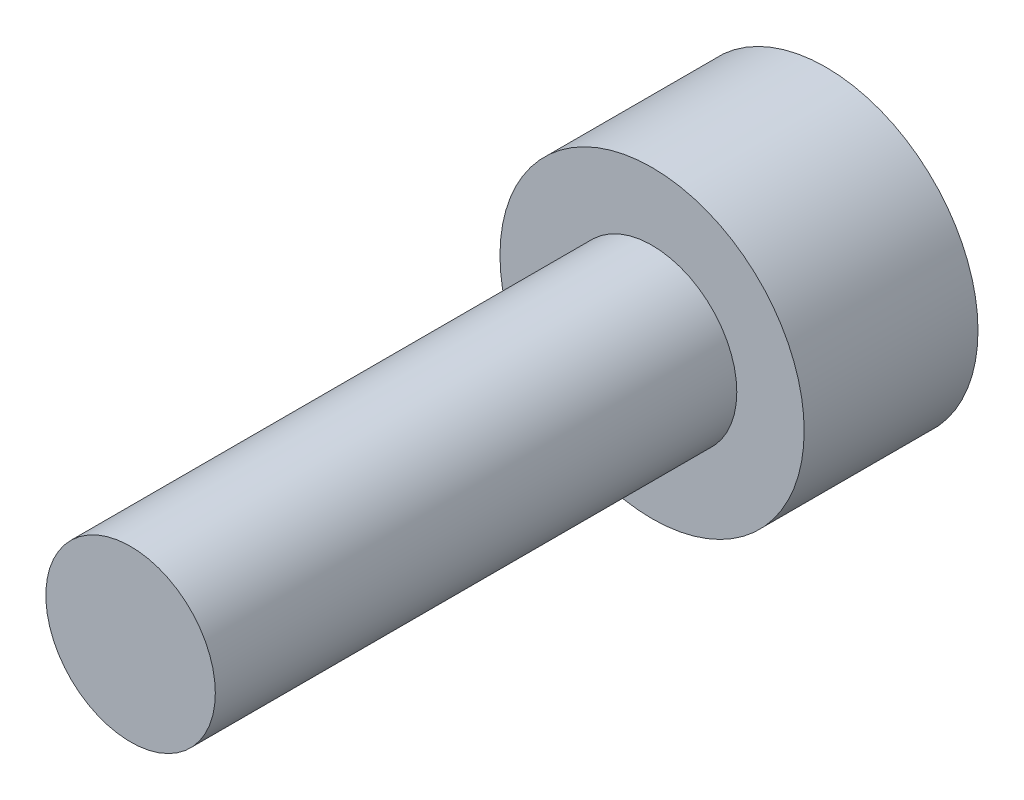
ISO-10303-21;
HEADER;
FILE_DESCRIPTION(('STEP AP214'),'2;1');
FILE_NAME('part.step','',(''),(''),'','','');
FILE_SCHEMA(('AUTOMOTIVE_DESIGN { 1 0 10303 214 1 1 1 1 }'));
ENDSEC;
DATA;
#1=APPLICATION_CONTEXT('core data for automotive mechanical design processes');
#2=APPLICATION_PROTOCOL_DEFINITION('international standard','automotive_design',2000,#1);
#3=PRODUCT_CONTEXT('',#1,'mechanical');
#4=PRODUCT('Part','Part','',(#3));
#5=PRODUCT_RELATED_PRODUCT_CATEGORY('part','',(#4));
#6=PRODUCT_DEFINITION_FORMATION('','',#4);
#7=PRODUCT_DEFINITION_CONTEXT('part definition',#1,'design');
#8=PRODUCT_DEFINITION('design','',#6,#7);
#9=PRODUCT_DEFINITION_SHAPE('','',#8);
#10=(LENGTH_UNIT() NAMED_UNIT(*) SI_UNIT(.MILLI.,.METRE.));
#11=(NAMED_UNIT(*) PLANE_ANGLE_UNIT() SI_UNIT($,.RADIAN.));
#12=(NAMED_UNIT(*) SI_UNIT($,.STERADIAN.) SOLID_ANGLE_UNIT());
#13=UNCERTAINTY_MEASURE_WITH_UNIT(LENGTH_MEASURE(1.E-05),#10,'distance_accuracy_value','');
#14=(GEOMETRIC_REPRESENTATION_CONTEXT(3) GLOBAL_UNCERTAINTY_ASSIGNED_CONTEXT((#13)) GLOBAL_UNIT_ASSIGNED_CONTEXT((#10,
#11,#12)) REPRESENTATION_CONTEXT('',''));
#15=CARTESIAN_POINT('',(0.,0.,0.));
#16=DIRECTION('',(0.,0.,1.));
#17=DIRECTION('',(1.,0.,0.));
#18=AXIS2_PLACEMENT_3D('',#15,#16,#17);
#19=CARTESIAN_POINT('',(0.,0.,12.));
#20=DIRECTION('',(0.,0.,-1.));
#21=DIRECTION('',(-1.,0.,0.));
#22=AXIS2_PLACEMENT_3D('',#19,#20,#21);
#23=CYLINDRICAL_SURFACE('',#22,1.95);
#24=CARTESIAN_POINT('',(0.,0.,12.));
#25=DIRECTION('',(0.,0.,1.));
#26=DIRECTION('',(1.,0.,0.));
#27=AXIS2_PLACEMENT_3D('',#24,#25,#26);
#28=CIRCLE('',#27,1.95);
#29=CARTESIAN_POINT('',(1.95,0.,12.));
#30=VERTEX_POINT('',#29);
#31=EDGE_CURVE('E10',#30,#30,#28,.T.);
#32=ORIENTED_EDGE('',*,*,#31,.F.);
#33=EDGE_LOOP('',(#32));
#34=FACE_BOUND('',#33,.T.);
#35=CARTESIAN_POINT('',(0.,0.,0.));
#36=DIRECTION('',(0.,0.,1.));
#37=DIRECTION('',(1.,0.,0.));
#38=AXIS2_PLACEMENT_3D('',#35,#36,#37);
#39=CIRCLE('',#38,1.95);
#40=CARTESIAN_POINT('',(1.95,0.,0.));
#41=VERTEX_POINT('',#40);
#42=EDGE_CURVE('E37',#41,#41,#39,.T.);
#43=ORIENTED_EDGE('',*,*,#42,.T.);
#44=EDGE_LOOP('',(#43));
#45=FACE_BOUND('',#44,.T.);
#46=ADVANCED_FACE('F31',(#34,#45),#23,.T.);
#47=CARTESIAN_POINT('',(0.,0.,12.));
#48=DIRECTION('',(0.,0.,1.));
#49=DIRECTION('',(1.,0.,0.));
#50=AXIS2_PLACEMENT_3D('',#47,#48,#49);
#51=PLANE('',#50);
#52=ORIENTED_EDGE('',*,*,#31,.T.);
#53=EDGE_LOOP('',(#52));
#54=FACE_BOUND('',#53,.T.);
#55=ADVANCED_FACE('F56',(#54),#51,.T.);
#56=CARTESIAN_POINT('',(0.,0.,-4.));
#57=DIRECTION('',(0.,0.,1.));
#58=DIRECTION('',(1.,0.,0.));
#59=AXIS2_PLACEMENT_3D('',#56,#57,#58);
#60=CYLINDRICAL_SURFACE('',#59,3.5);
#61=CARTESIAN_POINT('',(0.,0.,-4.));
#62=DIRECTION('',(0.,0.,1.));
#63=DIRECTION('',(1.,0.,0.));
#64=AXIS2_PLACEMENT_3D('',#61,#62,#63);
#65=CIRCLE('',#64,3.5);
#66=CARTESIAN_POINT('',(3.5,0.,-4.));
#67=VERTEX_POINT('',#66);
#68=EDGE_CURVE('E41',#67,#67,#65,.T.);
#69=ORIENTED_EDGE('',*,*,#68,.T.);
#70=EDGE_LOOP('',(#69));
#71=FACE_BOUND('',#70,.T.);
#72=CARTESIAN_POINT('',(0.,0.,0.));
#73=DIRECTION('',(0.,0.,1.));
#74=DIRECTION('',(1.,0.,0.));
#75=AXIS2_PLACEMENT_3D('',#72,#73,#74);
#76=CIRCLE('',#75,3.5);
#77=CARTESIAN_POINT('',(3.5,0.,0.));
#78=VERTEX_POINT('',#77);
#79=EDGE_CURVE('E45',#78,#78,#76,.T.);
#80=ORIENTED_EDGE('',*,*,#79,.F.);
#81=EDGE_LOOP('',(#80));
#82=FACE_BOUND('',#81,.T.);
#83=ADVANCED_FACE('F53',(#71,#82),#60,.T.);
#84=CARTESIAN_POINT('',(0.,0.,-4.));
#85=DIRECTION('',(0.,0.,1.));
#86=DIRECTION('',(1.,0.,0.));
#87=AXIS2_PLACEMENT_3D('',#84,#85,#86);
#88=PLANE('',#87);
#89=ORIENTED_EDGE('',*,*,#68,.F.);
#90=EDGE_LOOP('',(#89));
#91=FACE_BOUND('',#90,.T.);
#92=ADVANCED_FACE('F55',(#91),#88,.F.);
#93=CARTESIAN_POINT('',(0.,0.,0.));
#94=DIRECTION('',(0.,0.,1.));
#95=DIRECTION('',(1.,0.,0.));
#96=AXIS2_PLACEMENT_3D('',#93,#94,#95);
#97=PLANE('',#96);
#98=ORIENTED_EDGE('',*,*,#42,.F.);
#99=EDGE_LOOP('',(#98));
#100=FACE_BOUND('',#99,.T.);
#101=ORIENTED_EDGE('',*,*,#79,.T.);
#102=EDGE_LOOP('',(#101));
#103=FACE_BOUND('',#102,.T.);
#104=ADVANCED_FACE('F51',(#100,#103),#97,.T.);
#105=CLOSED_SHELL('',(#46,#55,#83,#92,#104));
#106=MANIFOLD_SOLID_BREP('B2',#105);
#107=ADVANCED_BREP_SHAPE_REPRESENTATION('',(#18,#106),#14);
#108=SHAPE_DEFINITION_REPRESENTATION(#9,#107);
ENDSEC;
END-ISO-10303-21;
